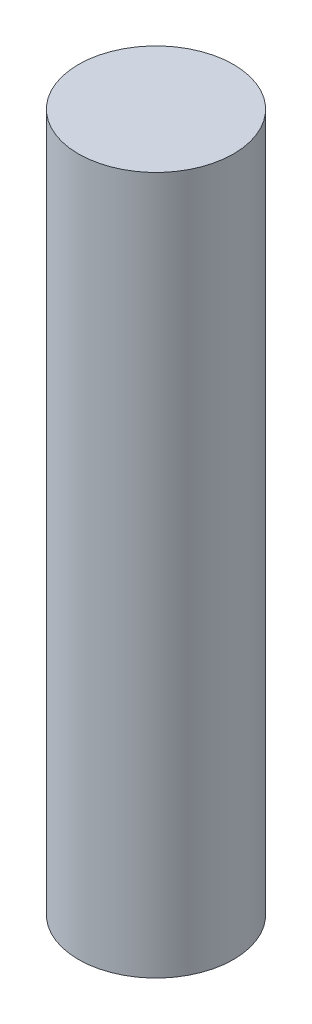
ISO-10303-21;
HEADER;
FILE_DESCRIPTION(('STEP AP214'),'2;1');
FILE_NAME('part.step','',(''),(''),'','','');
FILE_SCHEMA(('AUTOMOTIVE_DESIGN { 1 0 10303 214 1 1 1 1 }'));
ENDSEC;
DATA;
#1=APPLICATION_CONTEXT('core data for automotive mechanical design processes');
#2=APPLICATION_PROTOCOL_DEFINITION('international standard','automotive_design',2000,#1);
#3=PRODUCT_CONTEXT('',#1,'mechanical');
#4=PRODUCT('Part','Part','',(#3));
#5=PRODUCT_RELATED_PRODUCT_CATEGORY('part','',(#4));
#6=PRODUCT_DEFINITION_FORMATION('','',#4);
#7=PRODUCT_DEFINITION_CONTEXT('part definition',#1,'design');
#8=PRODUCT_DEFINITION('design','',#6,#7);
#9=PRODUCT_DEFINITION_SHAPE('','',#8);
#10=(LENGTH_UNIT() NAMED_UNIT(*) SI_UNIT(.MILLI.,.METRE.));
#11=(NAMED_UNIT(*) PLANE_ANGLE_UNIT() SI_UNIT($,.RADIAN.));
#12=(NAMED_UNIT(*) SI_UNIT($,.STERADIAN.) SOLID_ANGLE_UNIT());
#13=UNCERTAINTY_MEASURE_WITH_UNIT(LENGTH_MEASURE(1.E-05),#10,'distance_accuracy_value','');
#14=(GEOMETRIC_REPRESENTATION_CONTEXT(3) GLOBAL_UNCERTAINTY_ASSIGNED_CONTEXT((#13)) GLOBAL_UNIT_ASSIGNED_CONTEXT((#10,
#11,#12)) REPRESENTATION_CONTEXT('',''));
#15=CARTESIAN_POINT('',(0.,0.,0.));
#16=DIRECTION('',(0.,0.,1.));
#17=DIRECTION('',(1.,0.,0.));
#18=AXIS2_PLACEMENT_3D('',#15,#16,#17);
#19=CARTESIAN_POINT('',(0.,36.,0.));
#20=DIRECTION('',(0.,-1.,0.));
#21=DIRECTION('',(0.,0.,-1.));
#22=AXIS2_PLACEMENT_3D('',#19,#20,#21);
#23=CYLINDRICAL_SURFACE('',#22,4.);
#24=CARTESIAN_POINT('',(0.,36.,0.));
#25=DIRECTION('',(0.,1.,0.));
#26=DIRECTION('',(0.,0.,1.));
#27=AXIS2_PLACEMENT_3D('',#24,#25,#26);
#28=CIRCLE('',#27,4.);
#29=CARTESIAN_POINT('',(0.,36.,4.));
#30=VERTEX_POINT('',#29);
#31=EDGE_CURVE('E10',#30,#30,#28,.T.);
#32=ORIENTED_EDGE('',*,*,#31,.F.);
#33=EDGE_LOOP('',(#32));
#34=FACE_BOUND('',#33,.T.);
#35=CARTESIAN_POINT('',(0.,0.,0.));
#36=DIRECTION('',(0.,1.,0.));
#37=DIRECTION('',(0.,0.,1.));
#38=AXIS2_PLACEMENT_3D('',#35,#36,#37);
#39=CIRCLE('',#38,4.);
#40=CARTESIAN_POINT('',(0.,0.,4.));
#41=VERTEX_POINT('',#40);
#42=EDGE_CURVE('E44',#41,#41,#39,.T.);
#43=ORIENTED_EDGE('',*,*,#42,.T.);
#44=EDGE_LOOP('',(#43));
#45=FACE_BOUND('',#44,.T.);
#46=ADVANCED_FACE('F41',(#34,#45),#23,.T.);
#47=CARTESIAN_POINT('',(0.,36.,0.));
#48=DIRECTION('',(0.,1.,0.));
#49=DIRECTION('',(0.,0.,1.));
#50=AXIS2_PLACEMENT_3D('',#47,#48,#49);
#51=PLANE('',#50);
#52=ORIENTED_EDGE('',*,*,#31,.T.);
#53=EDGE_LOOP('',(#52));
#54=FACE_BOUND('',#53,.T.);
#55=ADVANCED_FACE('F58',(#54),#51,.T.);
#56=CARTESIAN_POINT('',(0.,0.,0.));
#57=DIRECTION('',(0.,1.,0.));
#58=DIRECTION('',(0.,0.,1.));
#59=AXIS2_PLACEMENT_3D('',#56,#57,#58);
#60=PLANE('',#59);
#61=ORIENTED_EDGE('',*,*,#42,.F.);
#62=EDGE_LOOP('',(#61));
#63=FACE_BOUND('',#62,.T.);
#64=ADVANCED_FACE('F56',(#63),#60,.F.);
#65=CLOSED_SHELL('',(#46,#55,#64));
#66=MANIFOLD_SOLID_BREP('B2',#65);
#67=ADVANCED_BREP_SHAPE_REPRESENTATION('',(#18,#66),#14);
#68=SHAPE_DEFINITION_REPRESENTATION(#9,#67);
ENDSEC;
END-ISO-10303-21;
